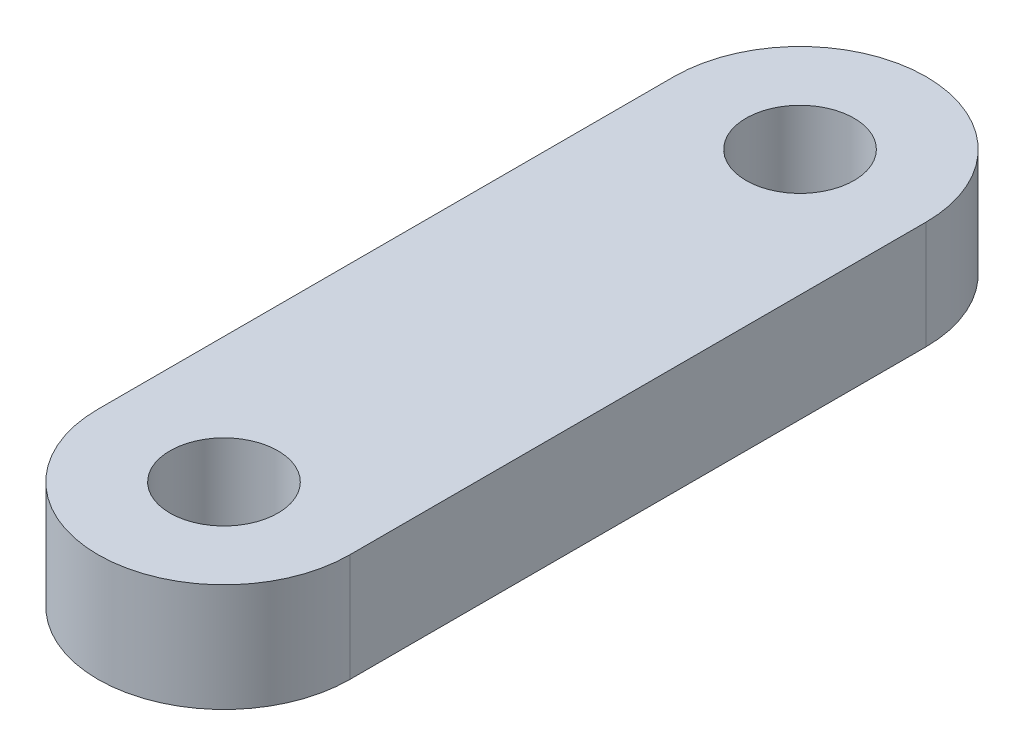
ISO-10303-21;
HEADER;
FILE_DESCRIPTION(('STEP AP214'),'2;1');
FILE_NAME('part.step','',(''),(''),'','','');
FILE_SCHEMA(('AUTOMOTIVE_DESIGN { 1 0 10303 214 1 1 1 1 }'));
ENDSEC;
DATA;
#1=APPLICATION_CONTEXT('core data for automotive mechanical design processes');
#2=APPLICATION_PROTOCOL_DEFINITION('international standard','automotive_design',2000,#1);
#3=PRODUCT_CONTEXT('',#1,'mechanical');
#4=PRODUCT('Part','Part','',(#3));
#5=PRODUCT_RELATED_PRODUCT_CATEGORY('part','',(#4));
#6=PRODUCT_DEFINITION_FORMATION('','',#4);
#7=PRODUCT_DEFINITION_CONTEXT('part definition',#1,'design');
#8=PRODUCT_DEFINITION('design','',#6,#7);
#9=PRODUCT_DEFINITION_SHAPE('','',#8);
#10=(LENGTH_UNIT() NAMED_UNIT(*) SI_UNIT(.MILLI.,.METRE.));
#11=(NAMED_UNIT(*) PLANE_ANGLE_UNIT() SI_UNIT($,.RADIAN.));
#12=(NAMED_UNIT(*) SI_UNIT($,.STERADIAN.) SOLID_ANGLE_UNIT());
#13=UNCERTAINTY_MEASURE_WITH_UNIT(LENGTH_MEASURE(1.E-05),#10,'distance_accuracy_value','');
#14=(GEOMETRIC_REPRESENTATION_CONTEXT(3) GLOBAL_UNCERTAINTY_ASSIGNED_CONTEXT((#13)) GLOBAL_UNIT_ASSIGNED_CONTEXT((#10,
#11,#12)) REPRESENTATION_CONTEXT('',''));
#15=CARTESIAN_POINT('',(0.,0.,0.));
#16=DIRECTION('',(0.,0.,1.));
#17=DIRECTION('',(1.,0.,0.));
#18=AXIS2_PLACEMENT_3D('',#15,#16,#17);
#19=CARTESIAN_POINT('',(0.,3.,8.));
#20=DIRECTION('',(0.,-1.,0.));
#21=DIRECTION('',(0.,0.,-1.));
#22=AXIS2_PLACEMENT_3D('',#19,#20,#21);
#23=CYLINDRICAL_SURFACE('',#22,3.5);
#24=CARTESIAN_POINT('',(0.,0.,8.));
#25=DIRECTION('',(0.,1.,0.));
#26=DIRECTION('',(0.,0.,1.));
#27=AXIS2_PLACEMENT_3D('',#24,#25,#26);
#28=CIRCLE('',#27,3.5);
#29=CARTESIAN_POINT('',(-3.5,0.,8.));
#30=VERTEX_POINT('',#29);
#31=CARTESIAN_POINT('',(3.5,0.,8.));
#32=VERTEX_POINT('',#31);
#33=EDGE_CURVE('E98',#30,#32,#28,.T.);
#34=ORIENTED_EDGE('',*,*,#33,.T.);
#35=DIRECTION('',(0.,-1.,0.));
#36=VECTOR('',#35,1.);
#37=CARTESIAN_POINT('',(3.5,3.,8.));
#38=LINE('',#37,#36);
#39=CARTESIAN_POINT('',(3.5,3.,8.));
#40=VERTEX_POINT('',#39);
#41=EDGE_CURVE('E11',#40,#32,#38,.T.);
#42=ORIENTED_EDGE('',*,*,#41,.F.);
#43=CARTESIAN_POINT('',(0.,3.,8.));
#44=DIRECTION('',(0.,1.,0.));
#45=DIRECTION('',(0.,0.,1.));
#46=AXIS2_PLACEMENT_3D('',#43,#44,#45);
#47=CIRCLE('',#46,3.5);
#48=CARTESIAN_POINT('',(-3.5,3.,8.));
#49=VERTEX_POINT('',#48);
#50=EDGE_CURVE('E86',#49,#40,#47,.T.);
#51=ORIENTED_EDGE('',*,*,#50,.F.);
#52=DIRECTION('',(0.,-1.,0.));
#53=VECTOR('',#52,1.);
#54=CARTESIAN_POINT('',(-3.5,3.,8.));
#55=LINE('',#54,#53);
#56=EDGE_CURVE('E94',#49,#30,#55,.T.);
#57=ORIENTED_EDGE('',*,*,#56,.T.);
#58=EDGE_LOOP('',(#34,#42,#51,#57));
#59=FACE_BOUND('',#58,.T.);
#60=ADVANCED_FACE('F35',(#59),#23,.T.);
#61=CARTESIAN_POINT('',(3.5,3.,8.));
#62=DIRECTION('',(-1.,0.,0.));
#63=DIRECTION('',(0.,0.,1.));
#64=AXIS2_PLACEMENT_3D('',#61,#62,#63);
#65=PLANE('',#64);
#66=DIRECTION('',(0.,0.,-1.));
#67=VECTOR('',#66,1.);
#68=CARTESIAN_POINT('',(3.5,0.,8.));
#69=LINE('',#68,#67);
#70=CARTESIAN_POINT('',(3.5,0.,-8.));
#71=VERTEX_POINT('',#70);
#72=EDGE_CURVE('E90',#32,#71,#69,.T.);
#73=ORIENTED_EDGE('',*,*,#72,.T.);
#74=DIRECTION('',(0.,-1.,0.));
#75=VECTOR('',#74,1.);
#76=CARTESIAN_POINT('',(3.5,3.,-8.));
#77=LINE('',#76,#75);
#78=CARTESIAN_POINT('',(3.5,3.,-8.));
#79=VERTEX_POINT('',#78);
#80=EDGE_CURVE('E43',#79,#71,#77,.T.);
#81=ORIENTED_EDGE('',*,*,#80,.F.);
#82=DIRECTION('',(0.,0.,-1.));
#83=VECTOR('',#82,1.);
#84=CARTESIAN_POINT('',(3.5,3.,8.));
#85=LINE('',#84,#83);
#86=EDGE_CURVE('E81',#40,#79,#85,.T.);
#87=ORIENTED_EDGE('',*,*,#86,.F.);
#88=ORIENTED_EDGE('',*,*,#41,.T.);
#89=EDGE_LOOP('',(#73,#81,#87,#88));
#90=FACE_BOUND('',#89,.T.);
#91=ADVANCED_FACE('F89',(#90),#65,.F.);
#92=CARTESIAN_POINT('',(0.,3.,-8.));
#93=DIRECTION('',(0.,-1.,0.));
#94=DIRECTION('',(0.,0.,-1.));
#95=AXIS2_PLACEMENT_3D('',#92,#93,#94);
#96=CYLINDRICAL_SURFACE('',#95,3.5);
#97=CARTESIAN_POINT('',(0.,0.,-8.));
#98=DIRECTION('',(0.,1.,0.));
#99=DIRECTION('',(0.,0.,1.));
#100=AXIS2_PLACEMENT_3D('',#97,#98,#99);
#101=CIRCLE('',#100,3.5);
#102=CARTESIAN_POINT('',(-3.50000000000001,0.,-8.));
#103=VERTEX_POINT('',#102);
#104=EDGE_CURVE('E68',#71,#103,#101,.T.);
#105=ORIENTED_EDGE('',*,*,#104,.T.);
#106=DIRECTION('',(0.,-1.,0.));
#107=VECTOR('',#106,1.);
#108=CARTESIAN_POINT('',(-3.50000000000001,3.,-8.));
#109=LINE('',#108,#107);
#110=CARTESIAN_POINT('',(-3.50000000000001,3.,-8.));
#111=VERTEX_POINT('',#110);
#112=EDGE_CURVE('E91',#111,#103,#109,.T.);
#113=ORIENTED_EDGE('',*,*,#112,.F.);
#114=CARTESIAN_POINT('',(0.,3.,-8.));
#115=DIRECTION('',(0.,1.,0.));
#116=DIRECTION('',(0.,0.,1.));
#117=AXIS2_PLACEMENT_3D('',#114,#115,#116);
#118=CIRCLE('',#117,3.5);
#119=EDGE_CURVE('E84',#79,#111,#118,.T.);
#120=ORIENTED_EDGE('',*,*,#119,.F.);
#121=ORIENTED_EDGE('',*,*,#80,.T.);
#122=EDGE_LOOP('',(#105,#113,#120,#121));
#123=FACE_BOUND('',#122,.T.);
#124=ADVANCED_FACE('F92',(#123),#96,.T.);
#125=CARTESIAN_POINT('',(-3.5,3.,8.));
#126=DIRECTION('',(1.,0.,0.));
#127=DIRECTION('',(0.,0.,-1.));
#128=AXIS2_PLACEMENT_3D('',#125,#126,#127);
#129=PLANE('',#128);
#130=DIRECTION('',(0.,0.,1.));
#131=VECTOR('',#130,1.);
#132=CARTESIAN_POINT('',(-3.5,0.,8.));
#133=LINE('',#132,#131);
#134=EDGE_CURVE('E74',#103,#30,#133,.T.);
#135=ORIENTED_EDGE('',*,*,#134,.T.);
#136=ORIENTED_EDGE('',*,*,#56,.F.);
#137=DIRECTION('',(0.,0.,1.));
#138=VECTOR('',#137,1.);
#139=CARTESIAN_POINT('',(-3.5,3.,8.));
#140=LINE('',#139,#138);
#141=EDGE_CURVE('E51',#111,#49,#140,.T.);
#142=ORIENTED_EDGE('',*,*,#141,.F.);
#143=ORIENTED_EDGE('',*,*,#112,.T.);
#144=EDGE_LOOP('',(#135,#136,#142,#143));
#145=FACE_BOUND('',#144,.T.);
#146=ADVANCED_FACE('F106',(#145),#129,.F.);
#147=CARTESIAN_POINT('',(0.,3.,8.));
#148=DIRECTION('',(0.,1.,0.));
#149=DIRECTION('',(0.,0.,1.));
#150=AXIS2_PLACEMENT_3D('',#147,#148,#149);
#151=PLANE('',#150);
#152=CARTESIAN_POINT('',(0.,3.,-8.));
#153=DIRECTION('',(0.,1.,0.));
#154=DIRECTION('',(0.,0.,1.));
#155=AXIS2_PLACEMENT_3D('',#152,#153,#154);
#156=CIRCLE('',#155,1.5);
#157=CARTESIAN_POINT('',(0.,3.,-6.5));
#158=VERTEX_POINT('',#157);
#159=EDGE_CURVE('E118',#158,#158,#156,.T.);
#160=ORIENTED_EDGE('',*,*,#159,.F.);
#161=EDGE_LOOP('',(#160));
#162=FACE_BOUND('',#161,.T.);
#163=CARTESIAN_POINT('',(0.,3.,8.));
#164=DIRECTION('',(0.,1.,0.));
#165=DIRECTION('',(0.,0.,1.));
#166=AXIS2_PLACEMENT_3D('',#163,#164,#165);
#167=CIRCLE('',#166,1.5);
#168=CARTESIAN_POINT('',(0.,3.,9.5));
#169=VERTEX_POINT('',#168);
#170=EDGE_CURVE('E112',#169,#169,#167,.T.);
#171=ORIENTED_EDGE('',*,*,#170,.F.);
#172=EDGE_LOOP('',(#171));
#173=FACE_BOUND('',#172,.T.);
#174=ORIENTED_EDGE('',*,*,#50,.T.);
#175=ORIENTED_EDGE('',*,*,#86,.T.);
#176=ORIENTED_EDGE('',*,*,#119,.T.);
#177=ORIENTED_EDGE('',*,*,#141,.T.);
#178=EDGE_LOOP('',(#174,#175,#176,#177));
#179=FACE_BOUND('',#178,.T.);
#180=ADVANCED_FACE('F82',(#162,#173,#179),#151,.T.);
#181=CARTESIAN_POINT('',(0.,0.,8.));
#182=DIRECTION('',(0.,1.,0.));
#183=DIRECTION('',(0.,0.,1.));
#184=AXIS2_PLACEMENT_3D('',#181,#182,#183);
#185=PLANE('',#184);
#186=CARTESIAN_POINT('',(0.,0.,-8.));
#187=DIRECTION('',(0.,1.,0.));
#188=DIRECTION('',(0.,0.,1.));
#189=AXIS2_PLACEMENT_3D('',#186,#187,#188);
#190=CIRCLE('',#189,1.5);
#191=CARTESIAN_POINT('',(0.,0.,-6.5));
#192=VERTEX_POINT('',#191);
#193=EDGE_CURVE('E101',#192,#192,#190,.T.);
#194=ORIENTED_EDGE('',*,*,#193,.T.);
#195=EDGE_LOOP('',(#194));
#196=FACE_BOUND('',#195,.T.);
#197=CARTESIAN_POINT('',(0.,0.,8.));
#198=DIRECTION('',(0.,1.,0.));
#199=DIRECTION('',(0.,0.,1.));
#200=AXIS2_PLACEMENT_3D('',#197,#198,#199);
#201=CIRCLE('',#200,1.5);
#202=CARTESIAN_POINT('',(0.,0.,9.5));
#203=VERTEX_POINT('',#202);
#204=EDGE_CURVE('E115',#203,#203,#201,.T.);
#205=ORIENTED_EDGE('',*,*,#204,.T.);
#206=EDGE_LOOP('',(#205));
#207=FACE_BOUND('',#206,.T.);
#208=ORIENTED_EDGE('',*,*,#33,.F.);
#209=ORIENTED_EDGE('',*,*,#134,.F.);
#210=ORIENTED_EDGE('',*,*,#104,.F.);
#211=ORIENTED_EDGE('',*,*,#72,.F.);
#212=EDGE_LOOP('',(#208,#209,#210,#211));
#213=FACE_BOUND('',#212,.T.);
#214=ADVANCED_FACE('F109',(#196,#207,#213),#185,.F.);
#215=CARTESIAN_POINT('',(0.,0.,8.));
#216=DIRECTION('',(0.,1.,0.));
#217=DIRECTION('',(0.,0.,1.));
#218=AXIS2_PLACEMENT_3D('',#215,#216,#217);
#219=CYLINDRICAL_SURFACE('',#218,1.5);
#220=ORIENTED_EDGE('',*,*,#204,.F.);
#221=EDGE_LOOP('',(#220));
#222=FACE_BOUND('',#221,.T.);
#223=ORIENTED_EDGE('',*,*,#170,.T.);
#224=EDGE_LOOP('',(#223));
#225=FACE_BOUND('',#224,.T.);
#226=ADVANCED_FACE('F129',(#222,#225),#219,.F.);
#227=CARTESIAN_POINT('',(0.,0.,-8.));
#228=DIRECTION('',(0.,1.,0.));
#229=DIRECTION('',(0.,0.,1.));
#230=AXIS2_PLACEMENT_3D('',#227,#228,#229);
#231=CYLINDRICAL_SURFACE('',#230,1.5);
#232=ORIENTED_EDGE('',*,*,#193,.F.);
#233=EDGE_LOOP('',(#232));
#234=FACE_BOUND('',#233,.T.);
#235=ORIENTED_EDGE('',*,*,#159,.T.);
#236=EDGE_LOOP('',(#235));
#237=FACE_BOUND('',#236,.T.);
#238=ADVANCED_FACE('F126',(#234,#237),#231,.F.);
#239=CLOSED_SHELL('',(#60,#91,#124,#146,#180,#214,#226,#238));
#240=MANIFOLD_SOLID_BREP('B2',#239);
#241=ADVANCED_BREP_SHAPE_REPRESENTATION('',(#18,#240),#14);
#242=SHAPE_DEFINITION_REPRESENTATION(#9,#241);
ENDSEC;
END-ISO-10303-21;
